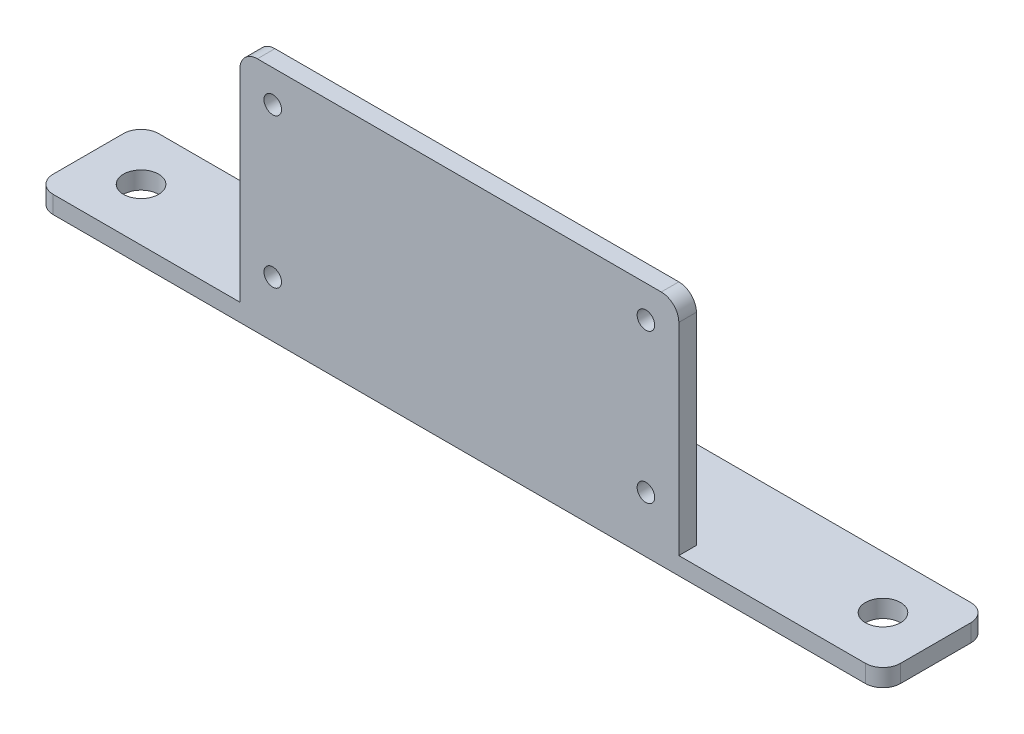
ISO-10303-21;
HEADER;
FILE_DESCRIPTION(('STEP AP214'),'2;1');
FILE_NAME('part.step','',(''),(''),'','','');
FILE_SCHEMA(('AUTOMOTIVE_DESIGN { 1 0 10303 214 1 1 1 1 }'));
ENDSEC;
DATA;
#1=APPLICATION_CONTEXT('core data for automotive mechanical design processes');
#2=APPLICATION_PROTOCOL_DEFINITION('international standard','automotive_design',2000,#1);
#3=PRODUCT_CONTEXT('',#1,'mechanical');
#4=PRODUCT('Part','Part','',(#3));
#5=PRODUCT_RELATED_PRODUCT_CATEGORY('part','',(#4));
#6=PRODUCT_DEFINITION_FORMATION('','',#4);
#7=PRODUCT_DEFINITION_CONTEXT('part definition',#1,'design');
#8=PRODUCT_DEFINITION('design','',#6,#7);
#9=PRODUCT_DEFINITION_SHAPE('','',#8);
#10=(LENGTH_UNIT() NAMED_UNIT(*) SI_UNIT(.MILLI.,.METRE.));
#11=(NAMED_UNIT(*) PLANE_ANGLE_UNIT() SI_UNIT($,.RADIAN.));
#12=(NAMED_UNIT(*) SI_UNIT($,.STERADIAN.) SOLID_ANGLE_UNIT());
#13=UNCERTAINTY_MEASURE_WITH_UNIT(LENGTH_MEASURE(1.E-05),#10,'distance_accuracy_value','');
#14=(GEOMETRIC_REPRESENTATION_CONTEXT(3) GLOBAL_UNCERTAINTY_ASSIGNED_CONTEXT((#13)) GLOBAL_UNIT_ASSIGNED_CONTEXT((#10,
#11,#12)) REPRESENTATION_CONTEXT('',''));
#15=CARTESIAN_POINT('',(0.,0.,0.));
#16=DIRECTION('',(0.,0.,1.));
#17=DIRECTION('',(1.,0.,0.));
#18=AXIS2_PLACEMENT_3D('',#15,#16,#17);
#19=CARTESIAN_POINT('',(0.,2.,0.));
#20=DIRECTION('',(0.,1.,0.));
#21=DIRECTION('',(0.,0.,1.));
#22=AXIS2_PLACEMENT_3D('',#19,#20,#21);
#23=PLANE('',#22);
#24=CARTESIAN_POINT('',(-42.25,2.,0.));
#25=DIRECTION('',(0.,1.,0.));
#26=DIRECTION('',(0.,0.,1.));
#27=AXIS2_PLACEMENT_3D('',#24,#25,#26);
#28=CIRCLE('',#27,2.);
#29=CARTESIAN_POINT('',(-42.25,2.,2.));
#30=VERTEX_POINT('',#29);
#31=EDGE_CURVE('E222',#30,#30,#28,.T.);
#32=ORIENTED_EDGE('',*,*,#31,.F.);
#33=EDGE_LOOP('',(#32));
#34=FACE_BOUND('',#33,.T.);
#35=CARTESIAN_POINT('',(42.25,2.,0.));
#36=DIRECTION('',(0.,1.,0.));
#37=DIRECTION('',(0.,0.,1.));
#38=AXIS2_PLACEMENT_3D('',#35,#36,#37);
#39=CIRCLE('',#38,2.);
#40=CARTESIAN_POINT('',(42.25,2.,2.));
#41=VERTEX_POINT('',#40);
#42=EDGE_CURVE('E225',#41,#41,#39,.T.);
#43=ORIENTED_EDGE('',*,*,#42,.F.);
#44=EDGE_LOOP('',(#43));
#45=FACE_BOUND('',#44,.T.);
#46=DIRECTION('',(0.,0.,1.));
#47=VECTOR('',#46,1.);
#48=CARTESIAN_POINT('',(-48.25,2.,0.));
#49=LINE('',#48,#47);
#50=CARTESIAN_POINT('',(-48.25,2.,-4.));
#51=VERTEX_POINT('',#50);
#52=CARTESIAN_POINT('',(-48.25,2.,4.));
#53=VERTEX_POINT('',#52);
#54=EDGE_CURVE('E190',#51,#53,#49,.T.);
#55=ORIENTED_EDGE('',*,*,#54,.T.);
#56=CARTESIAN_POINT('',(-46.25,2.,4.));
#57=DIRECTION('',(0.,1.,0.));
#58=DIRECTION('',(0.,0.,1.));
#59=AXIS2_PLACEMENT_3D('',#56,#57,#58);
#60=CIRCLE('',#59,2.);
#61=CARTESIAN_POINT('',(-46.25,2.,6.));
#62=VERTEX_POINT('',#61);
#63=EDGE_CURVE('E188',#53,#62,#60,.T.);
#64=ORIENTED_EDGE('',*,*,#63,.T.);
#65=DIRECTION('',(-1.,0.,0.));
#66=VECTOR('',#65,1.);
#67=CARTESIAN_POINT('',(0.,2.,6.));
#68=LINE('',#67,#66);
#69=CARTESIAN_POINT('',(-25.,2.,6.));
#70=VERTEX_POINT('',#69);
#71=EDGE_CURVE('E172',#70,#62,#68,.T.);
#72=ORIENTED_EDGE('',*,*,#71,.F.);
#73=DIRECTION('',(0.,0.,1.));
#74=VECTOR('',#73,1.);
#75=CARTESIAN_POINT('',(-25.,2.,0.));
#76=LINE('',#75,#74);
#77=CARTESIAN_POINT('',(-25.,2.,4.00000000000001));
#78=VERTEX_POINT('',#77);
#79=EDGE_CURVE('E185',#78,#70,#76,.T.);
#80=ORIENTED_EDGE('',*,*,#79,.F.);
#81=DIRECTION('',(-1.,0.,0.));
#82=VECTOR('',#81,1.);
#83=CARTESIAN_POINT('',(0.,2.,4.));
#84=LINE('',#83,#82);
#85=CARTESIAN_POINT('',(25.,2.,3.99999999999999));
#86=VERTEX_POINT('',#85);
#87=EDGE_CURVE('E195',#86,#78,#84,.T.);
#88=ORIENTED_EDGE('',*,*,#87,.F.);
#89=DIRECTION('',(0.,0.,1.));
#90=VECTOR('',#89,1.);
#91=CARTESIAN_POINT('',(25.,2.,0.));
#92=LINE('',#91,#90);
#93=CARTESIAN_POINT('',(25.,2.,6.));
#94=VERTEX_POINT('',#93);
#95=EDGE_CURVE('E194',#86,#94,#92,.T.);
#96=ORIENTED_EDGE('',*,*,#95,.T.);
#97=CARTESIAN_POINT('',(46.25,2.,6.));
#98=VERTEX_POINT('',#97);
#99=EDGE_CURVE('E189',#98,#94,#68,.T.);
#100=ORIENTED_EDGE('',*,*,#99,.F.);
#101=CARTESIAN_POINT('',(46.25,2.,4.));
#102=DIRECTION('',(0.,1.,0.));
#103=DIRECTION('',(0.,0.,1.));
#104=AXIS2_PLACEMENT_3D('',#101,#102,#103);
#105=CIRCLE('',#104,2.);
#106=CARTESIAN_POINT('',(48.25,2.,4.));
#107=VERTEX_POINT('',#106);
#108=EDGE_CURVE('E285',#98,#107,#105,.T.);
#109=ORIENTED_EDGE('',*,*,#108,.T.);
#110=DIRECTION('',(0.,0.,1.));
#111=VECTOR('',#110,1.);
#112=CARTESIAN_POINT('',(48.25,2.,0.));
#113=LINE('',#112,#111);
#114=CARTESIAN_POINT('',(48.25,2.,-4.));
#115=VERTEX_POINT('',#114);
#116=EDGE_CURVE('E219',#115,#107,#113,.T.);
#117=ORIENTED_EDGE('',*,*,#116,.F.);
#118=CARTESIAN_POINT('',(46.25,2.,-4.));
#119=DIRECTION('',(0.,1.,0.));
#120=DIRECTION('',(0.,0.,1.));
#121=AXIS2_PLACEMENT_3D('',#118,#119,#120);
#122=CIRCLE('',#121,2.);
#123=CARTESIAN_POINT('',(46.25,2.,-6.));
#124=VERTEX_POINT('',#123);
#125=EDGE_CURVE('E287',#115,#124,#122,.T.);
#126=ORIENTED_EDGE('',*,*,#125,.T.);
#127=DIRECTION('',(-1.,0.,0.));
#128=VECTOR('',#127,1.);
#129=CARTESIAN_POINT('',(0.,2.,-6.));
#130=LINE('',#129,#128);
#131=CARTESIAN_POINT('',(10.5405624267014,2.,-6.));
#132=VERTEX_POINT('',#131);
#133=EDGE_CURVE('E217',#124,#132,#130,.T.);
#134=ORIENTED_EDGE('',*,*,#133,.T.);
#135=CARTESIAN_POINT('',(10.5405624267014,2.,-4.));
#136=DIRECTION('',(0.,1.,0.));
#137=DIRECTION('',(0.,0.,1.));
#138=AXIS2_PLACEMENT_3D('',#135,#136,#137);
#139=CIRCLE('',#138,2.);
#140=CARTESIAN_POINT('',(8.57562104915215,2.,-4.37283425646655));
#141=VERTEX_POINT('',#140);
#142=EDGE_CURVE('E289',#132,#141,#139,.T.);
#143=ORIENTED_EDGE('',*,*,#142,.T.);
#144=CARTESIAN_POINT('',(0.,2.,-6.));
#145=DIRECTION('',(0.,1.,0.));
#146=DIRECTION('',(0.,0.,1.));
#147=AXIS2_PLACEMENT_3D('',#144,#145,#146);
#148=CIRCLE('',#147,8.72862788389963);
#149=CARTESIAN_POINT('',(-8.57562104915214,2.,-4.37283425646655));
#150=VERTEX_POINT('',#149);
#151=EDGE_CURVE('E211',#150,#141,#148,.T.);
#152=ORIENTED_EDGE('',*,*,#151,.F.);
#153=CARTESIAN_POINT('',(-10.5405624267014,2.,-4.));
#154=DIRECTION('',(0.,1.,0.));
#155=DIRECTION('',(0.,0.,1.));
#156=AXIS2_PLACEMENT_3D('',#153,#154,#155);
#157=CIRCLE('',#156,2.);
#158=CARTESIAN_POINT('',(-10.5405624267014,2.,-6.));
#159=VERTEX_POINT('',#158);
#160=EDGE_CURVE('E63',#150,#159,#157,.T.);
#161=ORIENTED_EDGE('',*,*,#160,.T.);
#162=CARTESIAN_POINT('',(-46.25,2.,-6.));
#163=VERTEX_POINT('',#162);
#164=EDGE_CURVE('E214',#159,#163,#130,.T.);
#165=ORIENTED_EDGE('',*,*,#164,.T.);
#166=CARTESIAN_POINT('',(-46.25,2.,-4.));
#167=DIRECTION('',(0.,1.,0.));
#168=DIRECTION('',(0.,0.,1.));
#169=AXIS2_PLACEMENT_3D('',#166,#167,#168);
#170=CIRCLE('',#169,2.);
#171=EDGE_CURVE('E292',#163,#51,#170,.T.);
#172=ORIENTED_EDGE('',*,*,#171,.T.);
#173=EDGE_LOOP('',(#55,#64,#72,#80,#88,#96,#100,#109,#117,#126,#134,#143,#152,#161,#165,#172));
#174=FACE_BOUND('',#173,.T.);
#175=ADVANCED_FACE('F41',(#34,#45,#174),#23,.T.);
#176=CARTESIAN_POINT('',(0.,2.,-6.));
#177=DIRECTION('',(0.,-1.,0.));
#178=DIRECTION('',(0.,0.,-1.));
#179=AXIS2_PLACEMENT_3D('',#176,#177,#178);
#180=CYLINDRICAL_SURFACE('',#179,8.72862788389963);
#181=CARTESIAN_POINT('',(0.,0.,-6.));
#182=DIRECTION('',(0.,1.,0.));
#183=DIRECTION('',(0.,0.,1.));
#184=AXIS2_PLACEMENT_3D('',#181,#182,#183);
#185=CIRCLE('',#184,8.72862788389963);
#186=CARTESIAN_POINT('',(-8.57562104915214,0.,-4.37283425646655));
#187=VERTEX_POINT('',#186);
#188=CARTESIAN_POINT('',(8.57562104915215,0.,-4.37283425646655));
#189=VERTEX_POINT('',#188);
#190=EDGE_CURVE('E210',#187,#189,#185,.T.);
#191=ORIENTED_EDGE('',*,*,#190,.F.);
#192=DIRECTION('',(0.,-1.,0.));
#193=VECTOR('',#192,1.);
#194=CARTESIAN_POINT('',(-8.57562104915214,2.,-4.37283425646655));
#195=LINE('',#194,#193);
#196=EDGE_CURVE('E302',#187,#150,#195,.F.);
#197=ORIENTED_EDGE('',*,*,#196,.T.);
#198=ORIENTED_EDGE('',*,*,#151,.T.);
#199=DIRECTION('',(0.,-1.,0.));
#200=VECTOR('',#199,1.);
#201=CARTESIAN_POINT('',(8.57562104915215,2.,-4.37283425646655));
#202=LINE('',#201,#200);
#203=EDGE_CURVE('E299',#141,#189,#202,.T.);
#204=ORIENTED_EDGE('',*,*,#203,.T.);
#205=EDGE_LOOP('',(#191,#197,#198,#204));
#206=FACE_BOUND('',#205,.T.);
#207=ADVANCED_FACE('F338',(#206),#180,.F.);
#208=CARTESIAN_POINT('',(0.,2.,-6.));
#209=DIRECTION('',(0.,0.,1.));
#210=DIRECTION('',(1.,0.,0.));
#211=AXIS2_PLACEMENT_3D('',#208,#209,#210);
#212=PLANE('',#211);
#213=DIRECTION('',(-1.,0.,0.));
#214=VECTOR('',#213,1.);
#215=CARTESIAN_POINT('',(0.,0.,-6.));
#216=LINE('',#215,#214);
#217=CARTESIAN_POINT('',(-10.5405624267014,0.,-6.));
#218=VERTEX_POINT('',#217);
#219=CARTESIAN_POINT('',(-46.25,0.,-6.));
#220=VERTEX_POINT('',#219);
#221=EDGE_CURVE('E231',#218,#220,#216,.T.);
#222=ORIENTED_EDGE('',*,*,#221,.T.);
#223=DIRECTION('',(0.,-1.,0.));
#224=VECTOR('',#223,1.);
#225=CARTESIAN_POINT('',(-46.25,2.,-6.));
#226=LINE('',#225,#224);
#227=EDGE_CURVE('E56',#220,#163,#226,.F.);
#228=ORIENTED_EDGE('',*,*,#227,.T.);
#229=ORIENTED_EDGE('',*,*,#164,.F.);
#230=DIRECTION('',(0.,1.,0.));
#231=VECTOR('',#230,1.);
#232=CARTESIAN_POINT('',(-10.5405624267014,0.,-6.));
#233=LINE('',#232,#231);
#234=EDGE_CURVE('E295',#159,#218,#233,.F.);
#235=ORIENTED_EDGE('',*,*,#234,.T.);
#236=EDGE_LOOP('',(#222,#228,#229,#235));
#237=FACE_BOUND('',#236,.T.);
#238=ADVANCED_FACE('F344',(#237),#212,.F.);
#239=CARTESIAN_POINT('',(-48.25,2.,0.));
#240=DIRECTION('',(1.,0.,0.));
#241=DIRECTION('',(0.,0.,-1.));
#242=AXIS2_PLACEMENT_3D('',#239,#240,#241);
#243=PLANE('',#242);
#244=DIRECTION('',(0.,0.,1.));
#245=VECTOR('',#244,1.);
#246=CARTESIAN_POINT('',(-48.25,0.,0.));
#247=LINE('',#246,#245);
#248=CARTESIAN_POINT('',(-48.25,0.,-4.));
#249=VERTEX_POINT('',#248);
#250=CARTESIAN_POINT('',(-48.25,0.,4.));
#251=VERTEX_POINT('',#250);
#252=EDGE_CURVE('E233',#249,#251,#247,.T.);
#253=ORIENTED_EDGE('',*,*,#252,.T.);
#254=DIRECTION('',(0.,-1.,0.));
#255=VECTOR('',#254,1.);
#256=CARTESIAN_POINT('',(-48.25,2.,4.));
#257=LINE('',#256,#255);
#258=EDGE_CURVE('E283',#251,#53,#257,.F.);
#259=ORIENTED_EDGE('',*,*,#258,.T.);
#260=ORIENTED_EDGE('',*,*,#54,.F.);
#261=DIRECTION('',(0.,-1.,0.));
#262=VECTOR('',#261,1.);
#263=CARTESIAN_POINT('',(-48.25,2.,-4.));
#264=LINE('',#263,#262);
#265=EDGE_CURVE('E280',#51,#249,#264,.T.);
#266=ORIENTED_EDGE('',*,*,#265,.T.);
#267=EDGE_LOOP('',(#253,#259,#260,#266));
#268=FACE_BOUND('',#267,.T.);
#269=ADVANCED_FACE('F352',(#268),#243,.F.);
#270=CARTESIAN_POINT('',(0.,2.,6.));
#271=DIRECTION('',(0.,0.,1.));
#272=DIRECTION('',(1.,0.,0.));
#273=AXIS2_PLACEMENT_3D('',#270,#271,#272);
#274=PLANE('',#273);
#275=CARTESIAN_POINT('',(-21.25,23.3547595910362,6.));
#276=DIRECTION('',(0.,0.,1.));
#277=DIRECTION('',(-1.,0.,0.));
#278=AXIS2_PLACEMENT_3D('',#275,#276,#277);
#279=CIRCLE('',#278,1.);
#280=CARTESIAN_POINT('',(-22.25,23.3547595910362,6.));
#281=VERTEX_POINT('',#280);
#282=EDGE_CURVE('E380',#281,#281,#279,.T.);
#283=ORIENTED_EDGE('',*,*,#282,.F.);
#284=EDGE_LOOP('',(#283));
#285=FACE_BOUND('',#284,.T.);
#286=CARTESIAN_POINT('',(21.25,6.35475959103615,6.));
#287=DIRECTION('',(0.,0.,1.));
#288=DIRECTION('',(-1.,0.,0.));
#289=AXIS2_PLACEMENT_3D('',#286,#287,#288);
#290=CIRCLE('',#289,1.);
#291=CARTESIAN_POINT('',(20.25,6.35475959103615,6.));
#292=VERTEX_POINT('',#291);
#293=EDGE_CURVE('E381',#292,#292,#290,.T.);
#294=ORIENTED_EDGE('',*,*,#293,.F.);
#295=EDGE_LOOP('',(#294));
#296=FACE_BOUND('',#295,.T.);
#297=CARTESIAN_POINT('',(-21.25,6.35475959103615,6.));
#298=DIRECTION('',(0.,0.,1.));
#299=DIRECTION('',(1.,0.,0.));
#300=AXIS2_PLACEMENT_3D('',#297,#298,#299);
#301=CIRCLE('',#300,1.00000000000001);
#302=CARTESIAN_POINT('',(-20.25,6.35475959103615,6.));
#303=VERTEX_POINT('',#302);
#304=EDGE_CURVE('E388',#303,#303,#301,.T.);
#305=ORIENTED_EDGE('',*,*,#304,.F.);
#306=EDGE_LOOP('',(#305));
#307=FACE_BOUND('',#306,.T.);
#308=CARTESIAN_POINT('',(21.25,23.3547595910362,6.));
#309=DIRECTION('',(0.,0.,1.));
#310=DIRECTION('',(1.,0.,0.));
#311=AXIS2_PLACEMENT_3D('',#308,#309,#310);
#312=CIRCLE('',#311,1.);
#313=CARTESIAN_POINT('',(22.25,23.3547595910362,6.));
#314=VERTEX_POINT('',#313);
#315=EDGE_CURVE('E377',#314,#314,#312,.T.);
#316=ORIENTED_EDGE('',*,*,#315,.F.);
#317=EDGE_LOOP('',(#316));
#318=FACE_BOUND('',#317,.T.);
#319=DIRECTION('',(0.,-1.,0.));
#320=VECTOR('',#319,1.);
#321=CARTESIAN_POINT('',(25.,27.,6.));
#322=LINE('',#321,#320);
#323=CARTESIAN_POINT('',(25.,25.,6.));
#324=VERTEX_POINT('',#323);
#325=EDGE_CURVE('E180',#324,#94,#322,.T.);
#326=ORIENTED_EDGE('',*,*,#325,.F.);
#327=CARTESIAN_POINT('',(23.,25.,6.));
#328=DIRECTION('',(0.,0.,1.));
#329=DIRECTION('',(1.,0.,0.));
#330=AXIS2_PLACEMENT_3D('',#327,#328,#329);
#331=CIRCLE('',#330,2.);
#332=CARTESIAN_POINT('',(23.,27.,6.));
#333=VERTEX_POINT('',#332);
#334=EDGE_CURVE('E255',#324,#333,#331,.T.);
#335=ORIENTED_EDGE('',*,*,#334,.T.);
#336=DIRECTION('',(1.,0.,0.));
#337=VECTOR('',#336,1.);
#338=CARTESIAN_POINT('',(0.,27.,6.));
#339=LINE('',#338,#337);
#340=CARTESIAN_POINT('',(-23.,27.,6.));
#341=VERTEX_POINT('',#340);
#342=EDGE_CURVE('E206',#341,#333,#339,.T.);
#343=ORIENTED_EDGE('',*,*,#342,.F.);
#344=CARTESIAN_POINT('',(-23.,25.,6.));
#345=DIRECTION('',(0.,0.,1.));
#346=DIRECTION('',(1.,0.,0.));
#347=AXIS2_PLACEMENT_3D('',#344,#345,#346);
#348=CIRCLE('',#347,2.);
#349=CARTESIAN_POINT('',(-25.,25.,6.));
#350=VERTEX_POINT('',#349);
#351=EDGE_CURVE('E175',#341,#350,#348,.T.);
#352=ORIENTED_EDGE('',*,*,#351,.T.);
#353=DIRECTION('',(0.,-1.,0.));
#354=VECTOR('',#353,1.);
#355=CARTESIAN_POINT('',(-25.,27.,6.));
#356=LINE('',#355,#354);
#357=EDGE_CURVE('E167',#350,#70,#356,.T.);
#358=ORIENTED_EDGE('',*,*,#357,.T.);
#359=ORIENTED_EDGE('',*,*,#71,.T.);
#360=DIRECTION('',(0.,-1.,0.));
#361=VECTOR('',#360,1.);
#362=CARTESIAN_POINT('',(-46.25,0.,6.));
#363=LINE('',#362,#361);
#364=CARTESIAN_POINT('',(-46.25,0.,6.));
#365=VERTEX_POINT('',#364);
#366=EDGE_CURVE('E252',#62,#365,#363,.T.);
#367=ORIENTED_EDGE('',*,*,#366,.T.);
#368=DIRECTION('',(-1.,0.,0.));
#369=VECTOR('',#368,1.);
#370=CARTESIAN_POINT('',(0.,0.,6.));
#371=LINE('',#370,#369);
#372=CARTESIAN_POINT('',(46.25,0.,6.));
#373=VERTEX_POINT('',#372);
#374=EDGE_CURVE('E237',#373,#365,#371,.T.);
#375=ORIENTED_EDGE('',*,*,#374,.F.);
#376=DIRECTION('',(0.,-1.,0.));
#377=VECTOR('',#376,1.);
#378=CARTESIAN_POINT('',(46.25,2.,6.));
#379=LINE('',#378,#377);
#380=EDGE_CURVE('E250',#373,#98,#379,.F.);
#381=ORIENTED_EDGE('',*,*,#380,.T.);
#382=ORIENTED_EDGE('',*,*,#99,.T.);
#383=EDGE_LOOP('',(#326,#335,#343,#352,#358,#359,#367,#375,#381,#382));
#384=FACE_BOUND('',#383,.T.);
#385=ADVANCED_FACE('F170',(#285,#296,#307,#318,#384),#274,.T.);
#386=CARTESIAN_POINT('',(48.25,2.,0.));
#387=DIRECTION('',(1.,0.,0.));
#388=DIRECTION('',(0.,0.,-1.));
#389=AXIS2_PLACEMENT_3D('',#386,#387,#388);
#390=PLANE('',#389);
#391=DIRECTION('',(0.,0.,1.));
#392=VECTOR('',#391,1.);
#393=CARTESIAN_POINT('',(48.25,0.,0.));
#394=LINE('',#393,#392);
#395=CARTESIAN_POINT('',(48.25,0.,-4.));
#396=VERTEX_POINT('',#395);
#397=CARTESIAN_POINT('',(48.25,0.,4.));
#398=VERTEX_POINT('',#397);
#399=EDGE_CURVE('E240',#396,#398,#394,.T.);
#400=ORIENTED_EDGE('',*,*,#399,.F.);
#401=DIRECTION('',(0.,-1.,0.));
#402=VECTOR('',#401,1.);
#403=CARTESIAN_POINT('',(48.25,2.,-4.));
#404=LINE('',#403,#402);
#405=EDGE_CURVE('E11',#396,#115,#404,.F.);
#406=ORIENTED_EDGE('',*,*,#405,.T.);
#407=ORIENTED_EDGE('',*,*,#116,.T.);
#408=DIRECTION('',(0.,-1.,0.));
#409=VECTOR('',#408,1.);
#410=CARTESIAN_POINT('',(48.25,2.,4.));
#411=LINE('',#410,#409);
#412=EDGE_CURVE('E49',#107,#398,#411,.T.);
#413=ORIENTED_EDGE('',*,*,#412,.T.);
#414=EDGE_LOOP('',(#400,#406,#407,#413));
#415=FACE_BOUND('',#414,.T.);
#416=ADVANCED_FACE('F312',(#415),#390,.T.);
#417=CARTESIAN_POINT('',(-42.25,2.,0.));
#418=DIRECTION('',(0.,-1.,0.));
#419=DIRECTION('',(0.,0.,-1.));
#420=AXIS2_PLACEMENT_3D('',#417,#418,#419);
#421=CYLINDRICAL_SURFACE('',#420,2.);
#422=ORIENTED_EDGE('',*,*,#31,.T.);
#423=EDGE_LOOP('',(#422));
#424=FACE_BOUND('',#423,.T.);
#425=CARTESIAN_POINT('',(-42.25,0.,0.));
#426=DIRECTION('',(0.,1.,0.));
#427=DIRECTION('',(0.,0.,1.));
#428=AXIS2_PLACEMENT_3D('',#425,#426,#427);
#429=CIRCLE('',#428,2.);
#430=CARTESIAN_POINT('',(-42.25,0.,2.));
#431=VERTEX_POINT('',#430);
#432=EDGE_CURVE('E243',#431,#431,#429,.T.);
#433=ORIENTED_EDGE('',*,*,#432,.F.);
#434=EDGE_LOOP('',(#433));
#435=FACE_BOUND('',#434,.T.);
#436=ADVANCED_FACE('F438',(#424,#435),#421,.F.);
#437=CARTESIAN_POINT('',(46.25,0.,-6.));
#438=VERTEX_POINT('',#437);
#439=CARTESIAN_POINT('',(10.5405624267014,0.,-6.));
#440=VERTEX_POINT('',#439);
#441=EDGE_CURVE('E234',#438,#440,#216,.T.);
#442=ORIENTED_EDGE('',*,*,#441,.T.);
#443=DIRECTION('',(0.,1.,0.));
#444=VECTOR('',#443,1.);
#445=CARTESIAN_POINT('',(10.5405624267014,2.,-6.));
#446=LINE('',#445,#444);
#447=EDGE_CURVE('E307',#440,#132,#446,.T.);
#448=ORIENTED_EDGE('',*,*,#447,.T.);
#449=ORIENTED_EDGE('',*,*,#133,.F.);
#450=DIRECTION('',(0.,-1.,0.));
#451=VECTOR('',#450,1.);
#452=CARTESIAN_POINT('',(46.25,0.,-6.));
#453=LINE('',#452,#451);
#454=EDGE_CURVE('E304',#124,#438,#453,.T.);
#455=ORIENTED_EDGE('',*,*,#454,.T.);
#456=EDGE_LOOP('',(#442,#448,#449,#455));
#457=FACE_BOUND('',#456,.T.);
#458=ADVANCED_FACE('F329',(#457),#212,.F.);
#459=CARTESIAN_POINT('',(42.25,2.,0.));
#460=DIRECTION('',(0.,-1.,0.));
#461=DIRECTION('',(0.,0.,-1.));
#462=AXIS2_PLACEMENT_3D('',#459,#460,#461);
#463=CYLINDRICAL_SURFACE('',#462,2.);
#464=ORIENTED_EDGE('',*,*,#42,.T.);
#465=EDGE_LOOP('',(#464));
#466=FACE_BOUND('',#465,.T.);
#467=CARTESIAN_POINT('',(42.25,0.,0.));
#468=DIRECTION('',(0.,1.,0.));
#469=DIRECTION('',(0.,0.,1.));
#470=AXIS2_PLACEMENT_3D('',#467,#468,#469);
#471=CIRCLE('',#470,2.);
#472=CARTESIAN_POINT('',(42.25,0.,2.));
#473=VERTEX_POINT('',#472);
#474=EDGE_CURVE('E215',#473,#473,#471,.T.);
#475=ORIENTED_EDGE('',*,*,#474,.F.);
#476=EDGE_LOOP('',(#475));
#477=FACE_BOUND('',#476,.T.);
#478=ADVANCED_FACE('F434',(#466,#477),#463,.F.);
#479=CARTESIAN_POINT('',(0.,0.,0.));
#480=DIRECTION('',(0.,1.,0.));
#481=DIRECTION('',(0.,0.,1.));
#482=AXIS2_PLACEMENT_3D('',#479,#480,#481);
#483=PLANE('',#482);
#484=ORIENTED_EDGE('',*,*,#374,.T.);
#485=CARTESIAN_POINT('',(-46.25,0.,4.));
#486=DIRECTION('',(0.,1.,0.));
#487=DIRECTION('',(0.,0.,1.));
#488=AXIS2_PLACEMENT_3D('',#485,#486,#487);
#489=CIRCLE('',#488,2.);
#490=EDGE_CURVE('E278',#365,#251,#489,.F.);
#491=ORIENTED_EDGE('',*,*,#490,.T.);
#492=ORIENTED_EDGE('',*,*,#252,.F.);
#493=CARTESIAN_POINT('',(-46.25,0.,-4.));
#494=DIRECTION('',(0.,1.,0.));
#495=DIRECTION('',(0.,0.,1.));
#496=AXIS2_PLACEMENT_3D('',#493,#494,#495);
#497=CIRCLE('',#496,2.);
#498=EDGE_CURVE('E276',#249,#220,#497,.F.);
#499=ORIENTED_EDGE('',*,*,#498,.T.);
#500=ORIENTED_EDGE('',*,*,#221,.F.);
#501=CARTESIAN_POINT('',(-10.5405624267014,0.,-4.));
#502=DIRECTION('',(0.,1.,0.));
#503=DIRECTION('',(0.,0.,1.));
#504=AXIS2_PLACEMENT_3D('',#501,#502,#503);
#505=CIRCLE('',#504,2.);
#506=EDGE_CURVE('E274',#218,#187,#505,.F.);
#507=ORIENTED_EDGE('',*,*,#506,.T.);
#508=ORIENTED_EDGE('',*,*,#190,.T.);
#509=CARTESIAN_POINT('',(10.5405624267014,0.,-4.));
#510=DIRECTION('',(0.,1.,0.));
#511=DIRECTION('',(0.,0.,1.));
#512=AXIS2_PLACEMENT_3D('',#509,#510,#511);
#513=CIRCLE('',#512,2.);
#514=EDGE_CURVE('E272',#189,#440,#513,.F.);
#515=ORIENTED_EDGE('',*,*,#514,.T.);
#516=ORIENTED_EDGE('',*,*,#441,.F.);
#517=CARTESIAN_POINT('',(46.25,0.,-4.));
#518=DIRECTION('',(0.,1.,0.));
#519=DIRECTION('',(0.,0.,1.));
#520=AXIS2_PLACEMENT_3D('',#517,#518,#519);
#521=CIRCLE('',#520,2.);
#522=EDGE_CURVE('E270',#438,#396,#521,.F.);
#523=ORIENTED_EDGE('',*,*,#522,.T.);
#524=ORIENTED_EDGE('',*,*,#399,.T.);
#525=CARTESIAN_POINT('',(46.25,0.,4.));
#526=DIRECTION('',(0.,1.,0.));
#527=DIRECTION('',(0.,0.,1.));
#528=AXIS2_PLACEMENT_3D('',#525,#526,#527);
#529=CIRCLE('',#528,2.);
#530=EDGE_CURVE('E268',#398,#373,#529,.F.);
#531=ORIENTED_EDGE('',*,*,#530,.T.);
#532=EDGE_LOOP('',(#484,#491,#492,#499,#500,#507,#508,#515,#516,#523,#524,#531));
#533=FACE_BOUND('',#532,.T.);
#534=ORIENTED_EDGE('',*,*,#432,.T.);
#535=EDGE_LOOP('',(#534));
#536=FACE_BOUND('',#535,.T.);
#537=ORIENTED_EDGE('',*,*,#474,.T.);
#538=EDGE_LOOP('',(#537));
#539=FACE_BOUND('',#538,.T.);
#540=ADVANCED_FACE('F318',(#533,#536,#539),#483,.F.);
#541=CARTESIAN_POINT('',(0.,27.,4.));
#542=DIRECTION('',(0.,0.,1.));
#543=DIRECTION('',(1.,0.,0.));
#544=AXIS2_PLACEMENT_3D('',#541,#542,#543);
#545=PLANE('',#544);
#546=CARTESIAN_POINT('',(-21.25,23.3547595910362,4.00000000000001));
#547=DIRECTION('',(0.,0.,1.));
#548=DIRECTION('',(1.,0.,0.));
#549=AXIS2_PLACEMENT_3D('',#546,#547,#548);
#550=CIRCLE('',#549,1.);
#551=CARTESIAN_POINT('',(-20.25,23.3547595910362,4.00000000000001));
#552=VERTEX_POINT('',#551);
#553=EDGE_CURVE('E384',#552,#552,#550,.F.);
#554=ORIENTED_EDGE('',*,*,#553,.F.);
#555=EDGE_LOOP('',(#554));
#556=FACE_BOUND('',#555,.T.);
#557=CARTESIAN_POINT('',(21.25,6.35475959103615,3.99999999999999));
#558=DIRECTION('',(0.,0.,1.));
#559=DIRECTION('',(1.,0.,0.));
#560=AXIS2_PLACEMENT_3D('',#557,#558,#559);
#561=CIRCLE('',#560,1.);
#562=CARTESIAN_POINT('',(22.25,6.35475959103615,3.99999999999999));
#563=VERTEX_POINT('',#562);
#564=EDGE_CURVE('E385',#563,#563,#561,.F.);
#565=ORIENTED_EDGE('',*,*,#564,.F.);
#566=EDGE_LOOP('',(#565));
#567=FACE_BOUND('',#566,.T.);
#568=CARTESIAN_POINT('',(-21.25,6.35475959103615,4.00000000000001));
#569=DIRECTION('',(0.,0.,1.));
#570=DIRECTION('',(1.,0.,0.));
#571=AXIS2_PLACEMENT_3D('',#568,#569,#570);
#572=CIRCLE('',#571,1.00000000000001);
#573=CARTESIAN_POINT('',(-20.25,6.35475959103615,4.00000000000001));
#574=VERTEX_POINT('',#573);
#575=EDGE_CURVE('E395',#574,#574,#572,.F.);
#576=ORIENTED_EDGE('',*,*,#575,.F.);
#577=EDGE_LOOP('',(#576));
#578=FACE_BOUND('',#577,.T.);
#579=CARTESIAN_POINT('',(21.25,23.3547595910362,3.99999999999999));
#580=DIRECTION('',(0.,0.,1.));
#581=DIRECTION('',(1.,0.,0.));
#582=AXIS2_PLACEMENT_3D('',#579,#580,#581);
#583=CIRCLE('',#582,1.);
#584=CARTESIAN_POINT('',(22.25,23.3547595910362,3.99999999999999));
#585=VERTEX_POINT('',#584);
#586=EDGE_CURVE('E200',#585,#585,#583,.F.);
#587=ORIENTED_EDGE('',*,*,#586,.F.);
#588=EDGE_LOOP('',(#587));
#589=FACE_BOUND('',#588,.T.);
#590=DIRECTION('',(-1.,0.,0.));
#591=VECTOR('',#590,1.);
#592=CARTESIAN_POINT('',(0.,27.,4.));
#593=LINE('',#592,#591);
#594=CARTESIAN_POINT('',(23.,27.,3.99999999999999));
#595=VERTEX_POINT('',#594);
#596=CARTESIAN_POINT('',(-23.,27.,4.00000000000001));
#597=VERTEX_POINT('',#596);
#598=EDGE_CURVE('E198',#595,#597,#593,.T.);
#599=ORIENTED_EDGE('',*,*,#598,.F.);
#600=CARTESIAN_POINT('',(23.,25.,3.99999999999999));
#601=DIRECTION('',(0.,0.,1.));
#602=DIRECTION('',(1.,0.,0.));
#603=AXIS2_PLACEMENT_3D('',#600,#601,#602);
#604=CIRCLE('',#603,2.);
#605=CARTESIAN_POINT('',(25.,25.,3.99999999999999));
#606=VERTEX_POINT('',#605);
#607=EDGE_CURVE('E264',#595,#606,#604,.F.);
#608=ORIENTED_EDGE('',*,*,#607,.T.);
#609=DIRECTION('',(0.,-1.,0.));
#610=VECTOR('',#609,1.);
#611=CARTESIAN_POINT('',(25.,27.,3.99999999999999));
#612=LINE('',#611,#610);
#613=EDGE_CURVE('E204',#606,#86,#612,.T.);
#614=ORIENTED_EDGE('',*,*,#613,.T.);
#615=ORIENTED_EDGE('',*,*,#87,.T.);
#616=DIRECTION('',(0.,-1.,0.));
#617=VECTOR('',#616,1.);
#618=CARTESIAN_POINT('',(-25.,27.,4.00000000000001));
#619=LINE('',#618,#617);
#620=CARTESIAN_POINT('',(-25.,25.,4.00000000000001));
#621=VERTEX_POINT('',#620);
#622=EDGE_CURVE('E179',#621,#78,#619,.T.);
#623=ORIENTED_EDGE('',*,*,#622,.F.);
#624=CARTESIAN_POINT('',(-23.,25.,4.00000000000001));
#625=DIRECTION('',(0.,0.,1.));
#626=DIRECTION('',(1.,0.,0.));
#627=AXIS2_PLACEMENT_3D('',#624,#625,#626);
#628=CIRCLE('',#627,2.);
#629=EDGE_CURVE('E262',#621,#597,#628,.F.);
#630=ORIENTED_EDGE('',*,*,#629,.T.);
#631=EDGE_LOOP('',(#599,#608,#614,#615,#623,#630));
#632=FACE_BOUND('',#631,.T.);
#633=ADVANCED_FACE('F401',(#556,#567,#578,#589,#632),#545,.F.);
#634=CARTESIAN_POINT('',(-25.,27.,0.));
#635=DIRECTION('',(1.,0.,0.));
#636=DIRECTION('',(0.,0.,-1.));
#637=AXIS2_PLACEMENT_3D('',#634,#635,#636);
#638=PLANE('',#637);
#639=ORIENTED_EDGE('',*,*,#357,.F.);
#640=DIRECTION('',(0.,0.,1.));
#641=VECTOR('',#640,1.);
#642=CARTESIAN_POINT('',(-25.,25.,4.00000000000001));
#643=LINE('',#642,#641);
#644=EDGE_CURVE('E266',#350,#621,#643,.F.);
#645=ORIENTED_EDGE('',*,*,#644,.T.);
#646=ORIENTED_EDGE('',*,*,#622,.T.);
#647=ORIENTED_EDGE('',*,*,#79,.T.);
#648=EDGE_LOOP('',(#639,#645,#646,#647));
#649=FACE_BOUND('',#648,.T.);
#650=ADVANCED_FACE('F192',(#649),#638,.F.);
#651=CARTESIAN_POINT('',(25.,27.,0.));
#652=DIRECTION('',(1.,0.,0.));
#653=DIRECTION('',(0.,0.,-1.));
#654=AXIS2_PLACEMENT_3D('',#651,#652,#653);
#655=PLANE('',#654);
#656=ORIENTED_EDGE('',*,*,#613,.F.);
#657=DIRECTION('',(0.,0.,1.));
#658=VECTOR('',#657,1.);
#659=CARTESIAN_POINT('',(25.,25.,0.));
#660=LINE('',#659,#658);
#661=EDGE_CURVE('E228',#606,#324,#660,.T.);
#662=ORIENTED_EDGE('',*,*,#661,.T.);
#663=ORIENTED_EDGE('',*,*,#325,.T.);
#664=ORIENTED_EDGE('',*,*,#95,.F.);
#665=EDGE_LOOP('',(#656,#662,#663,#664));
#666=FACE_BOUND('',#665,.T.);
#667=ADVANCED_FACE('F361',(#666),#655,.T.);
#668=CARTESIAN_POINT('',(0.,27.,0.));
#669=DIRECTION('',(0.,1.,0.));
#670=DIRECTION('',(0.,0.,1.));
#671=AXIS2_PLACEMENT_3D('',#668,#669,#670);
#672=PLANE('',#671);
#673=ORIENTED_EDGE('',*,*,#342,.T.);
#674=DIRECTION('',(0.,0.,1.));
#675=VECTOR('',#674,1.);
#676=CARTESIAN_POINT('',(23.,27.,0.));
#677=LINE('',#676,#675);
#678=EDGE_CURVE('E260',#333,#595,#677,.F.);
#679=ORIENTED_EDGE('',*,*,#678,.T.);
#680=ORIENTED_EDGE('',*,*,#598,.T.);
#681=DIRECTION('',(0.,0.,1.));
#682=VECTOR('',#681,1.);
#683=CARTESIAN_POINT('',(-23.,27.,5.99999999999999));
#684=LINE('',#683,#682);
#685=EDGE_CURVE('E257',#597,#341,#684,.T.);
#686=ORIENTED_EDGE('',*,*,#685,.T.);
#687=EDGE_LOOP('',(#673,#679,#680,#686));
#688=FACE_BOUND('',#687,.T.);
#689=ADVANCED_FACE('F369',(#688),#672,.T.);
#690=CARTESIAN_POINT('',(21.25,23.3547595910362,-6.001));
#691=DIRECTION('',(0.,0.,1.));
#692=DIRECTION('',(1.,0.,0.));
#693=AXIS2_PLACEMENT_3D('',#690,#691,#692);
#694=CYLINDRICAL_SURFACE('',#693,1.);
#695=ORIENTED_EDGE('',*,*,#315,.T.);
#696=EDGE_LOOP('',(#695));
#697=FACE_BOUND('',#696,.T.);
#698=ORIENTED_EDGE('',*,*,#586,.T.);
#699=EDGE_LOOP('',(#698));
#700=FACE_BOUND('',#699,.T.);
#701=ADVANCED_FACE('F528',(#697,#700),#694,.F.);
#702=CARTESIAN_POINT('',(-21.25,6.35475959103615,-6.001));
#703=DIRECTION('',(0.,0.,1.));
#704=DIRECTION('',(1.,0.,0.));
#705=AXIS2_PLACEMENT_3D('',#702,#703,#704);
#706=CYLINDRICAL_SURFACE('',#705,1.00000000000001);
#707=ORIENTED_EDGE('',*,*,#304,.T.);
#708=EDGE_LOOP('',(#707));
#709=FACE_BOUND('',#708,.T.);
#710=ORIENTED_EDGE('',*,*,#575,.T.);
#711=EDGE_LOOP('',(#710));
#712=FACE_BOUND('',#711,.T.);
#713=ADVANCED_FACE('F399',(#709,#712),#706,.F.);
#714=CARTESIAN_POINT('',(21.25,6.35475959103615,-6.001));
#715=DIRECTION('',(0.,0.,1.));
#716=DIRECTION('',(1.,0.,0.));
#717=AXIS2_PLACEMENT_3D('',#714,#715,#716);
#718=CYLINDRICAL_SURFACE('',#717,1.);
#719=ORIENTED_EDGE('',*,*,#293,.T.);
#720=EDGE_LOOP('',(#719));
#721=FACE_BOUND('',#720,.T.);
#722=ORIENTED_EDGE('',*,*,#564,.T.);
#723=EDGE_LOOP('',(#722));
#724=FACE_BOUND('',#723,.T.);
#725=ADVANCED_FACE('F545',(#721,#724),#718,.F.);
#726=CARTESIAN_POINT('',(-21.25,23.3547595910362,-6.001));
#727=DIRECTION('',(0.,0.,1.));
#728=DIRECTION('',(1.,0.,0.));
#729=AXIS2_PLACEMENT_3D('',#726,#727,#728);
#730=CYLINDRICAL_SURFACE('',#729,1.);
#731=ORIENTED_EDGE('',*,*,#282,.T.);
#732=EDGE_LOOP('',(#731));
#733=FACE_BOUND('',#732,.T.);
#734=ORIENTED_EDGE('',*,*,#553,.T.);
#735=EDGE_LOOP('',(#734));
#736=FACE_BOUND('',#735,.T.);
#737=ADVANCED_FACE('F418',(#733,#736),#730,.F.);
#738=CARTESIAN_POINT('',(23.,25.,0.));
#739=DIRECTION('',(0.,0.,1.));
#740=DIRECTION('',(1.,0.,0.));
#741=AXIS2_PLACEMENT_3D('',#738,#739,#740);
#742=CYLINDRICAL_SURFACE('',#741,2.);
#743=ORIENTED_EDGE('',*,*,#607,.F.);
#744=ORIENTED_EDGE('',*,*,#678,.F.);
#745=ORIENTED_EDGE('',*,*,#334,.F.);
#746=ORIENTED_EDGE('',*,*,#661,.F.);
#747=EDGE_LOOP('',(#743,#744,#745,#746));
#748=FACE_BOUND('',#747,.T.);
#749=ADVANCED_FACE('F365',(#748),#742,.T.);
#750=CARTESIAN_POINT('',(-23.,25.,0.));
#751=DIRECTION('',(0.,0.,-1.));
#752=DIRECTION('',(-1.,0.,0.));
#753=AXIS2_PLACEMENT_3D('',#750,#751,#752);
#754=CYLINDRICAL_SURFACE('',#753,2.);
#755=ORIENTED_EDGE('',*,*,#629,.F.);
#756=ORIENTED_EDGE('',*,*,#644,.F.);
#757=ORIENTED_EDGE('',*,*,#351,.F.);
#758=ORIENTED_EDGE('',*,*,#685,.F.);
#759=EDGE_LOOP('',(#755,#756,#757,#758));
#760=FACE_BOUND('',#759,.T.);
#761=ADVANCED_FACE('F410',(#760),#754,.T.);
#762=CARTESIAN_POINT('',(-46.25,2.,4.));
#763=DIRECTION('',(0.,1.,0.));
#764=DIRECTION('',(0.,0.,1.));
#765=AXIS2_PLACEMENT_3D('',#762,#763,#764);
#766=CYLINDRICAL_SURFACE('',#765,2.);
#767=ORIENTED_EDGE('',*,*,#63,.F.);
#768=ORIENTED_EDGE('',*,*,#258,.F.);
#769=ORIENTED_EDGE('',*,*,#490,.F.);
#770=ORIENTED_EDGE('',*,*,#366,.F.);
#771=EDGE_LOOP('',(#767,#768,#769,#770));
#772=FACE_BOUND('',#771,.T.);
#773=ADVANCED_FACE('F355',(#772),#766,.T.);
#774=CARTESIAN_POINT('',(-46.25,2.,-4.));
#775=DIRECTION('',(0.,-1.,0.));
#776=DIRECTION('',(0.,0.,-1.));
#777=AXIS2_PLACEMENT_3D('',#774,#775,#776);
#778=CYLINDRICAL_SURFACE('',#777,2.);
#779=ORIENTED_EDGE('',*,*,#171,.F.);
#780=ORIENTED_EDGE('',*,*,#227,.F.);
#781=ORIENTED_EDGE('',*,*,#498,.F.);
#782=ORIENTED_EDGE('',*,*,#265,.F.);
#783=EDGE_LOOP('',(#779,#780,#781,#782));
#784=FACE_BOUND('',#783,.T.);
#785=ADVANCED_FACE('F349',(#784),#778,.T.);
#786=CARTESIAN_POINT('',(-10.5405624267014,2.,-4.));
#787=DIRECTION('',(0.,-1.,0.));
#788=DIRECTION('',(0.,0.,-1.));
#789=AXIS2_PLACEMENT_3D('',#786,#787,#788);
#790=CYLINDRICAL_SURFACE('',#789,2.);
#791=ORIENTED_EDGE('',*,*,#160,.F.);
#792=ORIENTED_EDGE('',*,*,#196,.F.);
#793=ORIENTED_EDGE('',*,*,#506,.F.);
#794=ORIENTED_EDGE('',*,*,#234,.F.);
#795=EDGE_LOOP('',(#791,#792,#793,#794));
#796=FACE_BOUND('',#795,.T.);
#797=ADVANCED_FACE('F343',(#796),#790,.T.);
#798=CARTESIAN_POINT('',(10.5405624267014,2.,-4.));
#799=DIRECTION('',(0.,-1.,0.));
#800=DIRECTION('',(0.,0.,-1.));
#801=AXIS2_PLACEMENT_3D('',#798,#799,#800);
#802=CYLINDRICAL_SURFACE('',#801,2.);
#803=ORIENTED_EDGE('',*,*,#142,.F.);
#804=ORIENTED_EDGE('',*,*,#447,.F.);
#805=ORIENTED_EDGE('',*,*,#514,.F.);
#806=ORIENTED_EDGE('',*,*,#203,.F.);
#807=EDGE_LOOP('',(#803,#804,#805,#806));
#808=FACE_BOUND('',#807,.T.);
#809=ADVANCED_FACE('F335',(#808),#802,.T.);
#810=CARTESIAN_POINT('',(46.25,2.,-4.));
#811=DIRECTION('',(0.,1.,0.));
#812=DIRECTION('',(0.,0.,1.));
#813=AXIS2_PLACEMENT_3D('',#810,#811,#812);
#814=CYLINDRICAL_SURFACE('',#813,2.);
#815=ORIENTED_EDGE('',*,*,#125,.F.);
#816=ORIENTED_EDGE('',*,*,#405,.F.);
#817=ORIENTED_EDGE('',*,*,#522,.F.);
#818=ORIENTED_EDGE('',*,*,#454,.F.);
#819=EDGE_LOOP('',(#815,#816,#817,#818));
#820=FACE_BOUND('',#819,.T.);
#821=ADVANCED_FACE('F326',(#820),#814,.T.);
#822=CARTESIAN_POINT('',(46.25,2.,4.));
#823=DIRECTION('',(0.,-1.,0.));
#824=DIRECTION('',(0.,0.,-1.));
#825=AXIS2_PLACEMENT_3D('',#822,#823,#824);
#826=CYLINDRICAL_SURFACE('',#825,2.);
#827=ORIENTED_EDGE('',*,*,#108,.F.);
#828=ORIENTED_EDGE('',*,*,#380,.F.);
#829=ORIENTED_EDGE('',*,*,#530,.F.);
#830=ORIENTED_EDGE('',*,*,#412,.F.);
#831=EDGE_LOOP('',(#827,#828,#829,#830));
#832=FACE_BOUND('',#831,.T.);
#833=ADVANCED_FACE('F43',(#832),#826,.T.);
#834=CLOSED_SHELL('',(#175,#207,#238,#269,#385,#416,#436,#458,#478,#540,#633,#650,#667,#689,
#701,#713,#725,#737,#749,#761,#773,#785,#797,#809,#821,#833));
#835=MANIFOLD_SOLID_BREP('B2',#834);
#836=ADVANCED_BREP_SHAPE_REPRESENTATION('',(#18,#835),#14);
#837=SHAPE_DEFINITION_REPRESENTATION(#9,#836);
ENDSEC;
END-ISO-10303-21;
